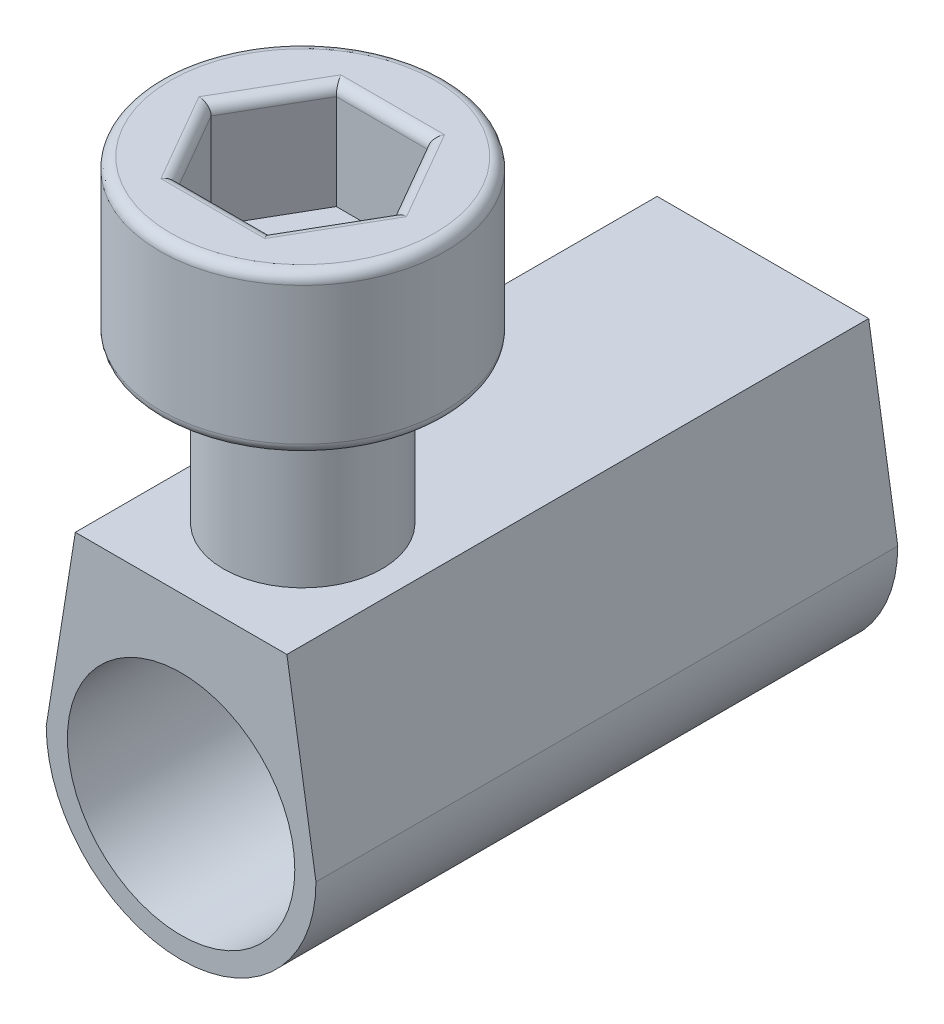
ISO-10303-21;
HEADER;
FILE_DESCRIPTION(('STEP AP214'),'2;1');
FILE_NAME('part.step','',(''),(''),'','','');
FILE_SCHEMA(('AUTOMOTIVE_DESIGN { 1 0 10303 214 1 1 1 1 }'));
ENDSEC;
DATA;
#1=APPLICATION_CONTEXT('core data for automotive mechanical design processes');
#2=APPLICATION_PROTOCOL_DEFINITION('international standard','automotive_design',2000,#1);
#3=PRODUCT_CONTEXT('',#1,'mechanical');
#4=PRODUCT('Part','Part','',(#3));
#5=PRODUCT_RELATED_PRODUCT_CATEGORY('part','',(#4));
#6=PRODUCT_DEFINITION_FORMATION('','',#4);
#7=PRODUCT_DEFINITION_CONTEXT('part definition',#1,'design');
#8=PRODUCT_DEFINITION('design','',#6,#7);
#9=PRODUCT_DEFINITION_SHAPE('','',#8);
#10=(LENGTH_UNIT() NAMED_UNIT(*) SI_UNIT(.MILLI.,.METRE.));
#11=(NAMED_UNIT(*) PLANE_ANGLE_UNIT() SI_UNIT($,.RADIAN.));
#12=(NAMED_UNIT(*) SI_UNIT($,.STERADIAN.) SOLID_ANGLE_UNIT());
#13=UNCERTAINTY_MEASURE_WITH_UNIT(LENGTH_MEASURE(1.E-05),#10,'distance_accuracy_value','');
#14=(GEOMETRIC_REPRESENTATION_CONTEXT(3) GLOBAL_UNCERTAINTY_ASSIGNED_CONTEXT((#13)) GLOBAL_UNIT_ASSIGNED_CONTEXT((#10,
#11,#12)) REPRESENTATION_CONTEXT('',''));
#15=CARTESIAN_POINT('',(0.,0.,0.));
#16=DIRECTION('',(0.,0.,1.));
#17=DIRECTION('',(1.,0.,0.));
#18=AXIS2_PLACEMENT_3D('',#15,#16,#17);
#19=CARTESIAN_POINT('',(0.,4.,-2.3));
#20=DIRECTION('',(0.,1.,0.));
#21=DIRECTION('',(0.,0.,1.));
#22=AXIS2_PLACEMENT_3D('',#19,#20,#21);
#23=CYLINDRICAL_SURFACE('',#22,1.5);
#24=CARTESIAN_POINT('',(0.,8.8,-2.3));
#25=DIRECTION('',(0.,1.,0.));
#26=DIRECTION('',(0.,0.,1.));
#27=AXIS2_PLACEMENT_3D('',#24,#25,#26);
#28=CIRCLE('',#27,1.5);
#29=CARTESIAN_POINT('',(0.,8.8,-0.8));
#30=VERTEX_POINT('',#29);
#31=EDGE_CURVE('E184',#30,#30,#28,.F.);
#32=ORIENTED_EDGE('',*,*,#31,.T.);
#33=EDGE_LOOP('',(#32));
#34=FACE_BOUND('',#33,.T.);
#35=CARTESIAN_POINT('',(0.,4.,-2.3));
#36=DIRECTION('',(0.,1.,0.));
#37=DIRECTION('',(0.,0.,1.));
#38=AXIS2_PLACEMENT_3D('',#35,#36,#37);
#39=CIRCLE('',#38,1.5);
#40=CARTESIAN_POINT('',(0.,4.,-0.8));
#41=VERTEX_POINT('',#40);
#42=EDGE_CURVE('E161',#41,#41,#39,.T.);
#43=ORIENTED_EDGE('',*,*,#42,.T.);
#44=EDGE_LOOP('',(#43));
#45=FACE_BOUND('',#44,.T.);
#46=ADVANCED_FACE('F51',(#34,#45),#23,.T.);
#47=CARTESIAN_POINT('',(0.,4.,-2.3));
#48=DIRECTION('',(0.,1.,0.));
#49=DIRECTION('',(0.,0.,1.));
#50=AXIS2_PLACEMENT_3D('',#47,#48,#49);
#51=PLANE('',#50);
#52=ORIENTED_EDGE('',*,*,#42,.F.);
#53=EDGE_LOOP('',(#52));
#54=FACE_BOUND('',#53,.T.);
#55=ADVANCED_FACE('F262',(#54),#51,.F.);
#56=CARTESIAN_POINT('',(0.,12.,-2.3));
#57=DIRECTION('',(0.,-1.,0.));
#58=DIRECTION('',(0.,0.,-1.));
#59=AXIS2_PLACEMENT_3D('',#56,#57,#58);
#60=CYLINDRICAL_SURFACE('',#59,2.7);
#61=CARTESIAN_POINT('',(0.,9.2,-2.3));
#62=DIRECTION('',(0.,1.,0.));
#63=DIRECTION('',(0.,0.,1.));
#64=AXIS2_PLACEMENT_3D('',#61,#62,#63);
#65=CIRCLE('',#64,2.7);
#66=CARTESIAN_POINT('',(0.,9.2,0.4));
#67=VERTEX_POINT('',#66);
#68=EDGE_CURVE('E175',#67,#67,#65,.T.);
#69=ORIENTED_EDGE('',*,*,#68,.T.);
#70=EDGE_LOOP('',(#69));
#71=FACE_BOUND('',#70,.T.);
#72=CARTESIAN_POINT('',(0.,11.8,-2.3));
#73=DIRECTION('',(0.,1.,0.));
#74=DIRECTION('',(0.,0.,1.));
#75=AXIS2_PLACEMENT_3D('',#72,#73,#74);
#76=CIRCLE('',#75,2.7);
#77=CARTESIAN_POINT('',(0.,11.8,0.4));
#78=VERTEX_POINT('',#77);
#79=EDGE_CURVE('E172',#78,#78,#76,.F.);
#80=ORIENTED_EDGE('',*,*,#79,.T.);
#81=EDGE_LOOP('',(#80));
#82=FACE_BOUND('',#81,.T.);
#83=ADVANCED_FACE('F268',(#71,#82),#60,.T.);
#84=CARTESIAN_POINT('',(0.,12.,-2.3));
#85=DIRECTION('',(0.,1.,0.));
#86=DIRECTION('',(0.,0.,1.));
#87=AXIS2_PLACEMENT_3D('',#84,#85,#86);
#88=PLANE('',#87);
#89=CARTESIAN_POINT('',(0.,12.,-2.3));
#90=DIRECTION('',(0.,1.,0.));
#91=DIRECTION('',(0.,0.,1.));
#92=AXIS2_PLACEMENT_3D('',#89,#90,#91);
#93=CIRCLE('',#92,2.5);
#94=CARTESIAN_POINT('',(0.,12.,0.2));
#95=VERTEX_POINT('',#94);
#96=EDGE_CURVE('E200',#95,#95,#93,.T.);
#97=ORIENTED_EDGE('',*,*,#96,.T.);
#98=EDGE_LOOP('',(#97));
#99=FACE_BOUND('',#98,.T.);
#100=DIRECTION('',(-1.,0.,0.));
#101=VECTOR('',#100,1.);
#102=CARTESIAN_POINT('',(0.866025403784439,12.,-4.));
#103=LINE('',#102,#101);
#104=CARTESIAN_POINT('',(-0.981495457622366,12.,-4.));
#105=VERTEX_POINT('',#104);
#106=CARTESIAN_POINT('',(0.981495457622364,12.,-4.));
#107=VERTEX_POINT('',#106);
#108=EDGE_CURVE('E195',#105,#107,#103,.F.);
#109=ORIENTED_EDGE('',*,*,#108,.T.);
#110=DIRECTION('',(-0.5,0.,-0.866025403784439));
#111=VECTOR('',#110,1.);
#112=CARTESIAN_POINT('',(1.90525588832577,12.,-2.4));
#113=LINE('',#112,#111);
#114=CARTESIAN_POINT('',(1.96299091524473,12.,-2.3));
#115=VERTEX_POINT('',#114);
#116=EDGE_CURVE('E197',#107,#115,#113,.F.);
#117=ORIENTED_EDGE('',*,*,#116,.T.);
#118=DIRECTION('',(0.5,0.,-0.866025403784439));
#119=VECTOR('',#118,1.);
#120=CARTESIAN_POINT('',(1.03923048454133,12.,-0.699999999999999));
#121=LINE('',#120,#119);
#122=CARTESIAN_POINT('',(0.981495457622364,12.,-0.599999999999999));
#123=VERTEX_POINT('',#122);
#124=EDGE_CURVE('E187',#115,#123,#121,.F.);
#125=ORIENTED_EDGE('',*,*,#124,.T.);
#126=DIRECTION('',(1.,0.,0.));
#127=VECTOR('',#126,1.);
#128=CARTESIAN_POINT('',(-0.866025403784439,12.,-0.599999999999998));
#129=LINE('',#128,#127);
#130=CARTESIAN_POINT('',(-0.981495457622364,12.,-0.599999999999998));
#131=VERTEX_POINT('',#130);
#132=EDGE_CURVE('E189',#123,#131,#129,.F.);
#133=ORIENTED_EDGE('',*,*,#132,.T.);
#134=DIRECTION('',(0.5,0.,0.866025403784439));
#135=VECTOR('',#134,1.);
#136=CARTESIAN_POINT('',(-1.90525588832577,12.,-2.2));
#137=LINE('',#136,#135);
#138=CARTESIAN_POINT('',(-1.96299091524473,12.,-2.3));
#139=VERTEX_POINT('',#138);
#140=EDGE_CURVE('E191',#131,#139,#137,.F.);
#141=ORIENTED_EDGE('',*,*,#140,.T.);
#142=DIRECTION('',(-0.5,0.,0.866025403784439));
#143=VECTOR('',#142,1.);
#144=CARTESIAN_POINT('',(-1.03923048454133,12.,-3.9));
#145=LINE('',#144,#143);
#146=EDGE_CURVE('E193',#139,#105,#145,.F.);
#147=ORIENTED_EDGE('',*,*,#146,.T.);
#148=EDGE_LOOP('',(#109,#117,#125,#133,#141,#147));
#149=FACE_BOUND('',#148,.T.);
#150=ADVANCED_FACE('F360',(#99,#149),#88,.T.);
#151=CARTESIAN_POINT('',(0.,9.,-2.3));
#152=DIRECTION('',(0.,1.,0.));
#153=DIRECTION('',(0.,0.,1.));
#154=AXIS2_PLACEMENT_3D('',#151,#152,#153);
#155=PLANE('',#154);
#156=CARTESIAN_POINT('',(0.,9.,-2.3));
#157=DIRECTION('',(0.,1.,0.));
#158=DIRECTION('',(0.,0.,1.));
#159=AXIS2_PLACEMENT_3D('',#156,#157,#158);
#160=CIRCLE('',#159,2.5);
#161=CARTESIAN_POINT('',(0.,9.,0.2));
#162=VERTEX_POINT('',#161);
#163=EDGE_CURVE('E181',#162,#162,#160,.F.);
#164=ORIENTED_EDGE('',*,*,#163,.T.);
#165=EDGE_LOOP('',(#164));
#166=FACE_BOUND('',#165,.T.);
#167=CARTESIAN_POINT('',(0.,9.,-2.3));
#168=DIRECTION('',(0.,1.,0.));
#169=DIRECTION('',(0.,0.,1.));
#170=AXIS2_PLACEMENT_3D('',#167,#168,#169);
#171=CIRCLE('',#170,1.7);
#172=CARTESIAN_POINT('',(0.,9.,-0.6));
#173=VERTEX_POINT('',#172);
#174=EDGE_CURVE('E178',#173,#173,#171,.T.);
#175=ORIENTED_EDGE('',*,*,#174,.T.);
#176=EDGE_LOOP('',(#175));
#177=FACE_BOUND('',#176,.T.);
#178=ADVANCED_FACE('F258',(#166,#177),#155,.F.);
#179=CARTESIAN_POINT('',(0.866025403784439,10.,-0.799999999999998));
#180=DIRECTION('',(0.866025403784439,0.,0.5));
#181=DIRECTION('',(0.5,0.,-0.866025403784439));
#182=AXIS2_PLACEMENT_3D('',#179,#180,#181);
#183=PLANE('',#182);
#184=DIRECTION('',(0.,1.,0.));
#185=VECTOR('',#184,1.);
#186=CARTESIAN_POINT('',(0.866025403784439,10.,-0.799999999999998));
#187=LINE('',#186,#185);
#188=CARTESIAN_POINT('',(0.866025403784439,10.,-0.799999999999998));
#189=VERTEX_POINT('',#188);
#190=CARTESIAN_POINT('',(0.866025403784439,11.8,-0.799999999999998));
#191=VERTEX_POINT('',#190);
#192=EDGE_CURVE('E159',#189,#191,#187,.T.);
#193=ORIENTED_EDGE('',*,*,#192,.T.);
#194=DIRECTION('',(0.5,0.,-0.866025403784439));
#195=VECTOR('',#194,1.);
#196=CARTESIAN_POINT('',(1.73205080756888,11.8,-2.3));
#197=LINE('',#196,#195);
#198=CARTESIAN_POINT('',(1.73205080756888,11.8,-2.3));
#199=VERTEX_POINT('',#198);
#200=EDGE_CURVE('E12',#191,#199,#197,.T.);
#201=ORIENTED_EDGE('',*,*,#200,.T.);
#202=DIRECTION('',(0.,1.,0.));
#203=VECTOR('',#202,1.);
#204=CARTESIAN_POINT('',(1.73205080756888,10.,-2.3));
#205=LINE('',#204,#203);
#206=CARTESIAN_POINT('',(1.73205080756888,10.,-2.3));
#207=VERTEX_POINT('',#206);
#208=EDGE_CURVE('E123',#207,#199,#205,.T.);
#209=ORIENTED_EDGE('',*,*,#208,.F.);
#210=DIRECTION('',(0.5,0.,-0.866025403784439));
#211=VECTOR('',#210,1.);
#212=CARTESIAN_POINT('',(0.866025403784439,10.,-0.799999999999998));
#213=LINE('',#212,#211);
#214=EDGE_CURVE('E127',#189,#207,#213,.T.);
#215=ORIENTED_EDGE('',*,*,#214,.F.);
#216=EDGE_LOOP('',(#193,#201,#209,#215));
#217=FACE_BOUND('',#216,.T.);
#218=ADVANCED_FACE('F125',(#217),#183,.F.);
#219=CARTESIAN_POINT('',(-0.866025403784439,10.,-0.799999999999998));
#220=DIRECTION('',(0.,0.,1.));
#221=DIRECTION('',(1.,0.,0.));
#222=AXIS2_PLACEMENT_3D('',#219,#220,#221);
#223=PLANE('',#222);
#224=DIRECTION('',(0.,1.,0.));
#225=VECTOR('',#224,1.);
#226=CARTESIAN_POINT('',(-0.866025403784439,10.,-0.799999999999998));
#227=LINE('',#226,#225);
#228=CARTESIAN_POINT('',(-0.866025403784439,10.,-0.799999999999998));
#229=VERTEX_POINT('',#228);
#230=CARTESIAN_POINT('',(-0.866025403784439,11.8,-0.799999999999998));
#231=VERTEX_POINT('',#230);
#232=EDGE_CURVE('E162',#229,#231,#227,.T.);
#233=ORIENTED_EDGE('',*,*,#232,.T.);
#234=DIRECTION('',(1.,0.,0.));
#235=VECTOR('',#234,1.);
#236=CARTESIAN_POINT('',(0.866025403784439,11.8,-0.799999999999998));
#237=LINE('',#236,#235);
#238=EDGE_CURVE('E60',#231,#191,#237,.T.);
#239=ORIENTED_EDGE('',*,*,#238,.T.);
#240=ORIENTED_EDGE('',*,*,#192,.F.);
#241=DIRECTION('',(1.,0.,0.));
#242=VECTOR('',#241,1.);
#243=CARTESIAN_POINT('',(-0.866025403784439,10.,-0.799999999999998));
#244=LINE('',#243,#242);
#245=EDGE_CURVE('E134',#229,#189,#244,.T.);
#246=ORIENTED_EDGE('',*,*,#245,.F.);
#247=EDGE_LOOP('',(#233,#239,#240,#246));
#248=FACE_BOUND('',#247,.T.);
#249=ADVANCED_FACE('F250',(#248),#223,.F.);
#250=CARTESIAN_POINT('',(-1.73205080756888,10.,-2.3));
#251=DIRECTION('',(-0.866025403784439,0.,0.5));
#252=DIRECTION('',(0.5,0.,0.866025403784439));
#253=AXIS2_PLACEMENT_3D('',#250,#251,#252);
#254=PLANE('',#253);
#255=DIRECTION('',(0.,1.,0.));
#256=VECTOR('',#255,1.);
#257=CARTESIAN_POINT('',(-1.73205080756888,10.,-2.3));
#258=LINE('',#257,#256);
#259=CARTESIAN_POINT('',(-1.73205080756888,10.,-2.3));
#260=VERTEX_POINT('',#259);
#261=CARTESIAN_POINT('',(-1.73205080756888,11.8,-2.3));
#262=VERTEX_POINT('',#261);
#263=EDGE_CURVE('E164',#260,#262,#258,.T.);
#264=ORIENTED_EDGE('',*,*,#263,.T.);
#265=DIRECTION('',(0.5,0.,0.866025403784439));
#266=VECTOR('',#265,1.);
#267=CARTESIAN_POINT('',(-0.866025403784439,11.8,-0.799999999999998));
#268=LINE('',#267,#266);
#269=EDGE_CURVE('E75',#262,#231,#268,.T.);
#270=ORIENTED_EDGE('',*,*,#269,.T.);
#271=ORIENTED_EDGE('',*,*,#232,.F.);
#272=DIRECTION('',(0.5,0.,0.866025403784438));
#273=VECTOR('',#272,1.);
#274=CARTESIAN_POINT('',(-1.73205080756888,10.,-2.3));
#275=LINE('',#274,#273);
#276=EDGE_CURVE('E156',#260,#229,#275,.T.);
#277=ORIENTED_EDGE('',*,*,#276,.F.);
#278=EDGE_LOOP('',(#264,#270,#271,#277));
#279=FACE_BOUND('',#278,.T.);
#280=ADVANCED_FACE('F249',(#279),#254,.F.);
#281=CARTESIAN_POINT('',(-0.86602540378444,10.,-3.8));
#282=DIRECTION('',(-0.866025403784439,0.,-0.5));
#283=DIRECTION('',(-0.5,0.,0.866025403784439));
#284=AXIS2_PLACEMENT_3D('',#281,#282,#283);
#285=PLANE('',#284);
#286=DIRECTION('',(0.,1.,0.));
#287=VECTOR('',#286,1.);
#288=CARTESIAN_POINT('',(-0.86602540378444,10.,-3.8));
#289=LINE('',#288,#287);
#290=CARTESIAN_POINT('',(-0.86602540378444,10.,-3.8));
#291=VERTEX_POINT('',#290);
#292=CARTESIAN_POINT('',(-0.86602540378444,11.8,-3.8));
#293=VERTEX_POINT('',#292);
#294=EDGE_CURVE('E166',#291,#293,#289,.T.);
#295=ORIENTED_EDGE('',*,*,#294,.T.);
#296=DIRECTION('',(-0.5,0.,0.866025403784439));
#297=VECTOR('',#296,1.);
#298=CARTESIAN_POINT('',(-1.73205080756888,11.8,-2.3));
#299=LINE('',#298,#297);
#300=EDGE_CURVE('E207',#293,#262,#299,.T.);
#301=ORIENTED_EDGE('',*,*,#300,.T.);
#302=ORIENTED_EDGE('',*,*,#263,.F.);
#303=DIRECTION('',(-0.5,0.,0.866025403784439));
#304=VECTOR('',#303,1.);
#305=CARTESIAN_POINT('',(-0.86602540378444,10.,-3.8));
#306=LINE('',#305,#304);
#307=EDGE_CURVE('E153',#291,#260,#306,.T.);
#308=ORIENTED_EDGE('',*,*,#307,.F.);
#309=EDGE_LOOP('',(#295,#301,#302,#308));
#310=FACE_BOUND('',#309,.T.);
#311=ADVANCED_FACE('F248',(#310),#285,.F.);
#312=CARTESIAN_POINT('',(0.866025403784439,10.,-3.8));
#313=DIRECTION('',(0.,0.,-1.));
#314=DIRECTION('',(-1.,0.,0.));
#315=AXIS2_PLACEMENT_3D('',#312,#313,#314);
#316=PLANE('',#315);
#317=DIRECTION('',(0.,1.,0.));
#318=VECTOR('',#317,1.);
#319=CARTESIAN_POINT('',(0.866025403784439,10.,-3.8));
#320=LINE('',#319,#318);
#321=CARTESIAN_POINT('',(0.866025403784439,10.,-3.8));
#322=VERTEX_POINT('',#321);
#323=CARTESIAN_POINT('',(0.866025403784439,11.8,-3.8));
#324=VERTEX_POINT('',#323);
#325=EDGE_CURVE('E133',#322,#324,#320,.T.);
#326=ORIENTED_EDGE('',*,*,#325,.T.);
#327=DIRECTION('',(-1.,0.,0.));
#328=VECTOR('',#327,1.);
#329=CARTESIAN_POINT('',(-0.86602540378444,11.8,-3.8));
#330=LINE('',#329,#328);
#331=EDGE_CURVE('E205',#324,#293,#330,.T.);
#332=ORIENTED_EDGE('',*,*,#331,.T.);
#333=ORIENTED_EDGE('',*,*,#294,.F.);
#334=DIRECTION('',(-1.,0.,0.));
#335=VECTOR('',#334,1.);
#336=CARTESIAN_POINT('',(0.866025403784439,10.,-3.8));
#337=LINE('',#336,#335);
#338=EDGE_CURVE('E143',#322,#291,#337,.T.);
#339=ORIENTED_EDGE('',*,*,#338,.F.);
#340=EDGE_LOOP('',(#326,#332,#333,#339));
#341=FACE_BOUND('',#340,.T.);
#342=ADVANCED_FACE('F244',(#341),#316,.F.);
#343=CARTESIAN_POINT('',(1.73205080756888,10.,-2.3));
#344=DIRECTION('',(0.866025403784439,0.,-0.5));
#345=DIRECTION('',(-0.5,0.,-0.866025403784439));
#346=AXIS2_PLACEMENT_3D('',#343,#344,#345);
#347=PLANE('',#346);
#348=ORIENTED_EDGE('',*,*,#208,.T.);
#349=DIRECTION('',(-0.5,0.,-0.866025403784439));
#350=VECTOR('',#349,1.);
#351=CARTESIAN_POINT('',(0.866025403784439,11.8,-3.8));
#352=LINE('',#351,#350);
#353=EDGE_CURVE('E203',#199,#324,#352,.T.);
#354=ORIENTED_EDGE('',*,*,#353,.T.);
#355=ORIENTED_EDGE('',*,*,#325,.F.);
#356=DIRECTION('',(-0.5,0.,-0.866025403784439));
#357=VECTOR('',#356,1.);
#358=CARTESIAN_POINT('',(1.73205080756888,10.,-2.3));
#359=LINE('',#358,#357);
#360=EDGE_CURVE('E137',#207,#322,#359,.T.);
#361=ORIENTED_EDGE('',*,*,#360,.F.);
#362=EDGE_LOOP('',(#348,#354,#355,#361));
#363=FACE_BOUND('',#362,.T.);
#364=ADVANCED_FACE('F138',(#363),#347,.F.);
#365=CARTESIAN_POINT('',(0.,10.,0.));
#366=DIRECTION('',(0.,1.,0.));
#367=DIRECTION('',(0.,0.,1.));
#368=AXIS2_PLACEMENT_3D('',#365,#366,#367);
#369=PLANE('',#368);
#370=ORIENTED_EDGE('',*,*,#214,.T.);
#371=ORIENTED_EDGE('',*,*,#360,.T.);
#372=ORIENTED_EDGE('',*,*,#338,.T.);
#373=ORIENTED_EDGE('',*,*,#307,.T.);
#374=ORIENTED_EDGE('',*,*,#276,.T.);
#375=ORIENTED_EDGE('',*,*,#245,.T.);
#376=EDGE_LOOP('',(#370,#371,#372,#373,#374,#375));
#377=FACE_BOUND('',#376,.T.);
#378=ADVANCED_FACE('F145',(#377),#369,.T.);
#379=CARTESIAN_POINT('',(0.,9.2,-2.3));
#380=DIRECTION('',(0.,1.,0.));
#381=DIRECTION('',(0.,0.,1.));
#382=AXIS2_PLACEMENT_3D('',#379,#380,#381);
#383=TOROIDAL_SURFACE('',#382,2.5,0.2);
#384=ORIENTED_EDGE('',*,*,#163,.F.);
#385=EDGE_LOOP('',(#384));
#386=FACE_BOUND('',#385,.T.);
#387=ORIENTED_EDGE('',*,*,#68,.F.);
#388=EDGE_LOOP('',(#387));
#389=FACE_BOUND('',#388,.T.);
#390=ADVANCED_FACE('F274',(#386,#389),#383,.T.);
#391=CARTESIAN_POINT('',(0.,8.8,-2.3));
#392=DIRECTION('',(0.,1.,0.));
#393=DIRECTION('',(0.,0.,1.));
#394=AXIS2_PLACEMENT_3D('',#391,#392,#393);
#395=TOROIDAL_SURFACE('',#394,1.7,0.2);
#396=ORIENTED_EDGE('',*,*,#31,.F.);
#397=EDGE_LOOP('',(#396));
#398=FACE_BOUND('',#397,.T.);
#399=ORIENTED_EDGE('',*,*,#174,.F.);
#400=EDGE_LOOP('',(#399));
#401=FACE_BOUND('',#400,.T.);
#402=ADVANCED_FACE('F277',(#398,#401),#395,.F.);
#403=CARTESIAN_POINT('',(0.,11.8,-2.3));
#404=DIRECTION('',(0.,1.,0.));
#405=DIRECTION('',(0.,0.,1.));
#406=AXIS2_PLACEMENT_3D('',#403,#404,#405);
#407=TOROIDAL_SURFACE('',#406,2.5,0.2);
#408=ORIENTED_EDGE('',*,*,#79,.F.);
#409=EDGE_LOOP('',(#408));
#410=FACE_BOUND('',#409,.T.);
#411=ORIENTED_EDGE('',*,*,#96,.F.);
#412=EDGE_LOOP('',(#411));
#413=FACE_BOUND('',#412,.T.);
#414=ADVANCED_FACE('F281',(#410,#413),#407,.T.);
#415=CARTESIAN_POINT('',(-1.90525588832577,11.8,-2.2));
#416=DIRECTION('',(-0.5,0.,-0.866025403784439));
#417=DIRECTION('',(-0.866025403784439,0.,0.5));
#418=AXIS2_PLACEMENT_3D('',#415,#416,#417);
#419=CYLINDRICAL_SURFACE('',#418,0.2);
#420=CARTESIAN_POINT('',(-1.96299091524473,11.8,-2.3));
#421=DIRECTION('',(0.,0.,-1.));
#422=DIRECTION('',(1.,0.,0.));
#423=AXIS2_PLACEMENT_3D('',#420,#421,#422);
#424=ELLIPSE('',#423,0.23094010767585,0.2);
#425=EDGE_CURVE('E150',#139,#262,#424,.T.);
#426=ORIENTED_EDGE('',*,*,#425,.F.);
#427=ORIENTED_EDGE('',*,*,#140,.F.);
#428=CARTESIAN_POINT('',(-0.981495457622365,11.8,-0.599999999999999));
#429=DIRECTION('',(-0.866025403784439,0.,-0.5));
#430=DIRECTION('',(0.5,0.,-0.866025403784439));
#431=AXIS2_PLACEMENT_3D('',#428,#429,#430);
#432=ELLIPSE('',#431,0.23094010767585,0.2);
#433=EDGE_CURVE('E55',#231,#131,#432,.F.);
#434=ORIENTED_EDGE('',*,*,#433,.F.);
#435=ORIENTED_EDGE('',*,*,#269,.F.);
#436=EDGE_LOOP('',(#426,#427,#434,#435));
#437=FACE_BOUND('',#436,.T.);
#438=ADVANCED_FACE('F53',(#437),#419,.T.);
#439=CARTESIAN_POINT('',(-0.866025403784439,11.8,-0.599999999999998));
#440=DIRECTION('',(-1.,0.,0.));
#441=DIRECTION('',(0.,0.,1.));
#442=AXIS2_PLACEMENT_3D('',#439,#440,#441);
#443=CYLINDRICAL_SURFACE('',#442,0.2);
#444=ORIENTED_EDGE('',*,*,#433,.T.);
#445=ORIENTED_EDGE('',*,*,#132,.F.);
#446=CARTESIAN_POINT('',(0.981495457622365,11.8,-0.599999999999999));
#447=DIRECTION('',(-0.866025403784439,0.,0.5));
#448=DIRECTION('',(-0.5,0.,-0.866025403784439));
#449=AXIS2_PLACEMENT_3D('',#446,#447,#448);
#450=ELLIPSE('',#449,0.23094010767585,0.2);
#451=EDGE_CURVE('E218',#191,#123,#450,.F.);
#452=ORIENTED_EDGE('',*,*,#451,.F.);
#453=ORIENTED_EDGE('',*,*,#238,.F.);
#454=EDGE_LOOP('',(#444,#445,#452,#453));
#455=FACE_BOUND('',#454,.T.);
#456=ADVANCED_FACE('F233',(#455),#443,.T.);
#457=CARTESIAN_POINT('',(-1.03923048454133,11.8,-3.9));
#458=DIRECTION('',(0.5,0.,-0.866025403784439));
#459=DIRECTION('',(-0.866025403784439,0.,-0.5));
#460=AXIS2_PLACEMENT_3D('',#457,#458,#459);
#461=CYLINDRICAL_SURFACE('',#460,0.2);
#462=ORIENTED_EDGE('',*,*,#425,.T.);
#463=ORIENTED_EDGE('',*,*,#300,.F.);
#464=CARTESIAN_POINT('',(-0.981495457622365,11.8,-4.));
#465=DIRECTION('',(0.866025403784438,0.,-0.5));
#466=DIRECTION('',(0.5,0.,0.866025403784438));
#467=AXIS2_PLACEMENT_3D('',#464,#465,#466);
#468=ELLIPSE('',#467,0.23094010767585,0.2);
#469=EDGE_CURVE('E215',#105,#293,#468,.T.);
#470=ORIENTED_EDGE('',*,*,#469,.F.);
#471=ORIENTED_EDGE('',*,*,#146,.F.);
#472=EDGE_LOOP('',(#462,#463,#470,#471));
#473=FACE_BOUND('',#472,.T.);
#474=ADVANCED_FACE('F225',(#473),#461,.T.);
#475=CARTESIAN_POINT('',(1.03923048454133,11.8,-0.699999999999999));
#476=DIRECTION('',(-0.5,0.,0.866025403784439));
#477=DIRECTION('',(0.866025403784439,0.,0.5));
#478=AXIS2_PLACEMENT_3D('',#475,#476,#477);
#479=CYLINDRICAL_SURFACE('',#478,0.2);
#480=ORIENTED_EDGE('',*,*,#451,.T.);
#481=ORIENTED_EDGE('',*,*,#124,.F.);
#482=CARTESIAN_POINT('',(1.96299091524473,11.8,-2.3));
#483=DIRECTION('',(0.,0.,1.));
#484=DIRECTION('',(1.,0.,0.));
#485=AXIS2_PLACEMENT_3D('',#482,#483,#484);
#486=ELLIPSE('',#485,0.23094010767585,0.2);
#487=EDGE_CURVE('E213',#199,#115,#486,.F.);
#488=ORIENTED_EDGE('',*,*,#487,.F.);
#489=ORIENTED_EDGE('',*,*,#200,.F.);
#490=EDGE_LOOP('',(#480,#481,#488,#489));
#491=FACE_BOUND('',#490,.T.);
#492=ADVANCED_FACE('F236',(#491),#479,.T.);
#493=CARTESIAN_POINT('',(0.866025403784439,11.8,-4.));
#494=DIRECTION('',(1.,0.,0.));
#495=DIRECTION('',(0.,0.,-1.));
#496=AXIS2_PLACEMENT_3D('',#493,#494,#495);
#497=CYLINDRICAL_SURFACE('',#496,0.2);
#498=ORIENTED_EDGE('',*,*,#469,.T.);
#499=ORIENTED_EDGE('',*,*,#331,.F.);
#500=CARTESIAN_POINT('',(0.981495457622364,11.8,-4.));
#501=DIRECTION('',(0.866025403784439,0.,0.5));
#502=DIRECTION('',(-0.5,0.,0.866025403784439));
#503=AXIS2_PLACEMENT_3D('',#500,#501,#502);
#504=ELLIPSE('',#503,0.23094010767585,0.2);
#505=EDGE_CURVE('E211',#107,#324,#504,.T.);
#506=ORIENTED_EDGE('',*,*,#505,.F.);
#507=ORIENTED_EDGE('',*,*,#108,.F.);
#508=EDGE_LOOP('',(#498,#499,#506,#507));
#509=FACE_BOUND('',#508,.T.);
#510=ADVANCED_FACE('F288',(#509),#497,.T.);
#511=CARTESIAN_POINT('',(1.90525588832577,11.8,-2.4));
#512=DIRECTION('',(0.5,0.,0.866025403784439));
#513=DIRECTION('',(0.866025403784439,0.,-0.5));
#514=AXIS2_PLACEMENT_3D('',#511,#512,#513);
#515=CYLINDRICAL_SURFACE('',#514,0.2);
#516=ORIENTED_EDGE('',*,*,#487,.T.);
#517=ORIENTED_EDGE('',*,*,#116,.F.);
#518=ORIENTED_EDGE('',*,*,#505,.T.);
#519=ORIENTED_EDGE('',*,*,#353,.F.);
#520=EDGE_LOOP('',(#516,#517,#518,#519));
#521=FACE_BOUND('',#520,.T.);
#522=ADVANCED_FACE('F240',(#521),#515,.T.);
#523=CLOSED_SHELL('',(#46,#55,#83,#150,#178,#218,#249,#280,#311,#342,#364,#378,#390,#402,#414,
#438,#456,#474,#492,#510,#522));
#524=MANIFOLD_SOLID_BREP('B2',#523);
#525=CARTESIAN_POINT('',(-2.55,2.55,-11.));
#526=DIRECTION('',(-0.987529784760243,0.157432284526995,0.));
#527=DIRECTION('',(-0.157432284526995,-0.987529784760243,0.));
#528=AXIS2_PLACEMENT_3D('',#525,#526,#527);
#529=PLANE('',#528);
#530=DIRECTION('',(-0.157432284526995,-0.987529784760243,0.));
#531=VECTOR('',#530,1.);
#532=CARTESIAN_POINT('',(-2.55,2.55,0.));
#533=LINE('',#532,#531);
#534=CARTESIAN_POINT('',(-2.,6.,0.));
#535=VERTEX_POINT('',#534);
#536=CARTESIAN_POINT('',(-2.55,2.55,0.));
#537=VERTEX_POINT('',#536);
#538=EDGE_CURVE('E523',#535,#537,#533,.T.);
#539=ORIENTED_EDGE('',*,*,#538,.F.);
#540=DIRECTION('',(0.,0.,1.));
#541=VECTOR('',#540,1.);
#542=CARTESIAN_POINT('',(-2.,6.,-11.));
#543=LINE('',#542,#541);
#544=CARTESIAN_POINT('',(-2.,6.,-11.));
#545=VERTEX_POINT('',#544);
#546=EDGE_CURVE('E49',#545,#535,#543,.T.);
#547=ORIENTED_EDGE('',*,*,#546,.F.);
#548=DIRECTION('',(-0.157432284526995,-0.987529784760243,0.));
#549=VECTOR('',#548,1.);
#550=CARTESIAN_POINT('',(-2.55,2.55,-11.));
#551=LINE('',#550,#549);
#552=CARTESIAN_POINT('',(-2.55,2.55,-11.));
#553=VERTEX_POINT('',#552);
#554=EDGE_CURVE('E514',#545,#553,#551,.T.);
#555=ORIENTED_EDGE('',*,*,#554,.T.);
#556=DIRECTION('',(0.,0.,1.));
#557=VECTOR('',#556,1.);
#558=CARTESIAN_POINT('',(-2.55,2.55,-11.));
#559=LINE('',#558,#557);
#560=EDGE_CURVE('E455',#553,#537,#559,.T.);
#561=ORIENTED_EDGE('',*,*,#560,.T.);
#562=EDGE_LOOP('',(#539,#547,#555,#561));
#563=FACE_BOUND('',#562,.T.);
#564=ADVANCED_FACE('F452',(#563),#529,.T.);
#565=CARTESIAN_POINT('',(-2.,6.,-11.));
#566=DIRECTION('',(0.,1.,0.));
#567=DIRECTION('',(0.,0.,1.));
#568=AXIS2_PLACEMENT_3D('',#565,#566,#567);
#569=PLANE('',#568);
#570=CARTESIAN_POINT('',(0.,6.,-2.3));
#571=DIRECTION('',(0.,1.,0.));
#572=DIRECTION('',(0.,0.,1.));
#573=AXIS2_PLACEMENT_3D('',#570,#571,#572);
#574=CIRCLE('',#573,1.5);
#575=CARTESIAN_POINT('',(0.,6.,-0.8));
#576=VERTEX_POINT('',#575);
#577=EDGE_CURVE('E581',#576,#576,#574,.T.);
#578=ORIENTED_EDGE('',*,*,#577,.F.);
#579=EDGE_LOOP('',(#578));
#580=FACE_BOUND('',#579,.T.);
#581=DIRECTION('',(-1.,0.,0.));
#582=VECTOR('',#581,1.);
#583=CARTESIAN_POINT('',(-2.,6.,0.));
#584=LINE('',#583,#582);
#585=CARTESIAN_POINT('',(2.,6.,0.));
#586=VERTEX_POINT('',#585);
#587=EDGE_CURVE('E517',#586,#535,#584,.T.);
#588=ORIENTED_EDGE('',*,*,#587,.F.);
#589=DIRECTION('',(0.,0.,1.));
#590=VECTOR('',#589,1.);
#591=CARTESIAN_POINT('',(2.,6.,-11.));
#592=LINE('',#591,#590);
#593=CARTESIAN_POINT('',(2.,6.,-11.));
#594=VERTEX_POINT('',#593);
#595=EDGE_CURVE('E462',#594,#586,#592,.T.);
#596=ORIENTED_EDGE('',*,*,#595,.F.);
#597=DIRECTION('',(-1.,0.,0.));
#598=VECTOR('',#597,1.);
#599=CARTESIAN_POINT('',(-2.,6.,-11.));
#600=LINE('',#599,#598);
#601=EDGE_CURVE('E509',#594,#545,#600,.T.);
#602=ORIENTED_EDGE('',*,*,#601,.T.);
#603=ORIENTED_EDGE('',*,*,#546,.T.);
#604=EDGE_LOOP('',(#588,#596,#602,#603));
#605=FACE_BOUND('',#604,.T.);
#606=ADVANCED_FACE('F540',(#580,#605),#569,.T.);
#607=CARTESIAN_POINT('',(2.,6.,-11.));
#608=DIRECTION('',(0.987529784760243,0.157432284526995,0.));
#609=DIRECTION('',(-0.157432284526995,0.987529784760243,0.));
#610=AXIS2_PLACEMENT_3D('',#607,#608,#609);
#611=PLANE('',#610);
#612=DIRECTION('',(-0.157432284526995,0.987529784760243,0.));
#613=VECTOR('',#612,1.);
#614=CARTESIAN_POINT('',(2.,6.,0.));
#615=LINE('',#614,#613);
#616=CARTESIAN_POINT('',(2.55,2.55,0.));
#617=VERTEX_POINT('',#616);
#618=EDGE_CURVE('E503',#617,#586,#615,.T.);
#619=ORIENTED_EDGE('',*,*,#618,.F.);
#620=DIRECTION('',(0.,0.,1.));
#621=VECTOR('',#620,1.);
#622=CARTESIAN_POINT('',(2.55,2.55,-11.));
#623=LINE('',#622,#621);
#624=CARTESIAN_POINT('',(2.55,2.55,-11.));
#625=VERTEX_POINT('',#624);
#626=EDGE_CURVE('E498',#625,#617,#623,.T.);
#627=ORIENTED_EDGE('',*,*,#626,.F.);
#628=DIRECTION('',(-0.157432284526995,0.987529784760243,0.));
#629=VECTOR('',#628,1.);
#630=CARTESIAN_POINT('',(2.,6.,-11.));
#631=LINE('',#630,#629);
#632=EDGE_CURVE('E501',#625,#594,#631,.T.);
#633=ORIENTED_EDGE('',*,*,#632,.T.);
#634=ORIENTED_EDGE('',*,*,#595,.T.);
#635=EDGE_LOOP('',(#619,#627,#633,#634));
#636=FACE_BOUND('',#635,.T.);
#637=ADVANCED_FACE('F500',(#636),#611,.T.);
#638=CARTESIAN_POINT('',(0.,2.55,-11.));
#639=DIRECTION('',(0.,0.,1.));
#640=DIRECTION('',(1.,0.,0.));
#641=AXIS2_PLACEMENT_3D('',#638,#639,#640);
#642=CYLINDRICAL_SURFACE('',#641,2.55);
#643=CARTESIAN_POINT('',(0.,2.55,0.));
#644=DIRECTION('',(0.,0.,1.));
#645=DIRECTION('',(-1.,0.,0.));
#646=AXIS2_PLACEMENT_3D('',#643,#644,#645);
#647=CIRCLE('',#646,2.55);
#648=EDGE_CURVE('E527',#537,#617,#647,.T.);
#649=ORIENTED_EDGE('',*,*,#648,.F.);
#650=ORIENTED_EDGE('',*,*,#560,.F.);
#651=CARTESIAN_POINT('',(0.,2.55,-11.));
#652=DIRECTION('',(0.,0.,1.));
#653=DIRECTION('',(-1.,0.,0.));
#654=AXIS2_PLACEMENT_3D('',#651,#652,#653);
#655=CIRCLE('',#654,2.55);
#656=EDGE_CURVE('E508',#553,#625,#655,.T.);
#657=ORIENTED_EDGE('',*,*,#656,.T.);
#658=ORIENTED_EDGE('',*,*,#626,.T.);
#659=EDGE_LOOP('',(#649,#650,#657,#658));
#660=FACE_BOUND('',#659,.T.);
#661=ADVANCED_FACE('F512',(#660),#642,.T.);
#662=CARTESIAN_POINT('',(0.,2.55,-11.));
#663=DIRECTION('',(0.,0.,-1.));
#664=DIRECTION('',(-1.,0.,0.));
#665=AXIS2_PLACEMENT_3D('',#662,#663,#664);
#666=PLANE('',#665);
#667=CARTESIAN_POINT('',(0.,2.55,-11.));
#668=DIRECTION('',(0.,0.,1.));
#669=DIRECTION('',(1.,0.,0.));
#670=AXIS2_PLACEMENT_3D('',#667,#668,#669);
#671=CIRCLE('',#670,2.15);
#672=CARTESIAN_POINT('',(2.15,2.55,-11.));
#673=VERTEX_POINT('',#672);
#674=EDGE_CURVE('E528',#673,#673,#671,.T.);
#675=ORIENTED_EDGE('',*,*,#674,.T.);
#676=EDGE_LOOP('',(#675));
#677=FACE_BOUND('',#676,.T.);
#678=ORIENTED_EDGE('',*,*,#554,.F.);
#679=ORIENTED_EDGE('',*,*,#601,.F.);
#680=ORIENTED_EDGE('',*,*,#632,.F.);
#681=ORIENTED_EDGE('',*,*,#656,.F.);
#682=EDGE_LOOP('',(#678,#679,#680,#681));
#683=FACE_BOUND('',#682,.T.);
#684=ADVANCED_FACE('F507',(#677,#683),#666,.T.);
#685=CARTESIAN_POINT('',(0.,2.55,0.));
#686=DIRECTION('',(0.,0.,-1.));
#687=DIRECTION('',(-1.,0.,0.));
#688=AXIS2_PLACEMENT_3D('',#685,#686,#687);
#689=PLANE('',#688);
#690=CARTESIAN_POINT('',(0.,2.55,0.));
#691=DIRECTION('',(0.,0.,1.));
#692=DIRECTION('',(1.,0.,0.));
#693=AXIS2_PLACEMENT_3D('',#690,#691,#692);
#694=CIRCLE('',#693,2.15);
#695=CARTESIAN_POINT('',(2.15,2.55,0.));
#696=VERTEX_POINT('',#695);
#697=EDGE_CURVE('E585',#696,#696,#694,.T.);
#698=ORIENTED_EDGE('',*,*,#697,.F.);
#699=EDGE_LOOP('',(#698));
#700=FACE_BOUND('',#699,.T.);
#701=ORIENTED_EDGE('',*,*,#538,.T.);
#702=ORIENTED_EDGE('',*,*,#648,.T.);
#703=ORIENTED_EDGE('',*,*,#618,.T.);
#704=ORIENTED_EDGE('',*,*,#587,.T.);
#705=EDGE_LOOP('',(#701,#702,#703,#704));
#706=FACE_BOUND('',#705,.T.);
#707=ADVANCED_FACE('F539',(#700,#706),#689,.F.);
#708=CARTESIAN_POINT('',(0.,2.55,-11.));
#709=DIRECTION('',(0.,0.,1.));
#710=DIRECTION('',(1.,0.,0.));
#711=AXIS2_PLACEMENT_3D('',#708,#709,#710);
#712=CYLINDRICAL_SURFACE('',#711,2.15);
#713=CARTESIAN_POINT('',(0.,4.7,-0.8));
#714=CARTESIAN_POINT('',(-0.0746464812663337,4.70000282641263,-0.799996929496405));
#715=CARTESIAN_POINT('',(-0.149277180476069,4.6960809829614,-0.80560151303327));
#716=CARTESIAN_POINT('',(-0.29613428994231,4.68078803821147,-0.827647971052697));
#717=CARTESIAN_POINT('',(-0.368359889040576,4.66941444990432,-0.844093463683328));
#718=CARTESIAN_POINT('',(-0.508056243300109,4.64032364191206,-0.88677865173462));
#719=CARTESIAN_POINT('',(-0.575548163520699,4.62263714305727,-0.912970941653959));
#720=CARTESIAN_POINT('',(-0.704857005323505,4.58230653566732,-0.973993377528605));
#721=CARTESIAN_POINT('',(-0.766673103764453,4.55966170965299,-1.00882477367562));
#722=CARTESIAN_POINT('',(-0.889035217129865,4.50879657072506,-1.08944207193295));
#723=CARTESIAN_POINT('',(-0.948989528092066,4.48026081548717,-1.13592272510136));
#724=CARTESIAN_POINT('',(-1.06079257205669,4.42115680639133,-1.23679733449923));
#725=CARTESIAN_POINT('',(-1.1126289613356,4.39058555613566,-1.29120310344179));
#726=CARTESIAN_POINT('',(-1.21601711406621,4.32431436419345,-1.41734698746795));
#727=CARTESIAN_POINT('',(-1.26593565795947,4.28865191343429,-1.49045246249999));
#728=CARTESIAN_POINT('',(-1.35280066322279,4.22195215158785,-1.64591501365008));
#729=CARTESIAN_POINT('',(-1.38976891344895,4.19090712284115,-1.72825623937877));
#730=CARTESIAN_POINT('',(-1.43970529082291,4.14702679941268,-1.87430618829028));
#731=CARTESIAN_POINT('',(-1.45656086118332,4.13152996642698,-1.93587637409803));
#732=CARTESIAN_POINT('',(-1.48237290477855,4.10736606480379,-2.06190408565345));
#733=CARTESIAN_POINT('',(-1.49134470044406,4.09868575149741,-2.12635575364091));
#734=CARTESIAN_POINT('',(-1.50081204155495,4.08951730308727,-2.25685378311678));
#735=CARTESIAN_POINT('',(-1.50126005231938,4.08907510987882,-2.32290703189861));
#736=CARTESIAN_POINT('',(-1.49351718879468,4.09658677525499,-2.45403726485773));
#737=CARTESIAN_POINT('',(-1.48532031903166,4.10454646078802,-2.51911353970959));
#738=CARTESIAN_POINT('',(-1.46168867886267,4.12676962885257,-2.64227227686338));
#739=CARTESIAN_POINT('',(-1.44675368180077,4.14059443812693,-2.70053530322033));
#740=CARTESIAN_POINT('',(-1.41054043997062,4.17279478750898,-2.81372412931401));
#741=CARTESIAN_POINT('',(-1.38925713374324,4.19117395678748,-2.86864722392484));
#742=CARTESIAN_POINT('',(-1.32823315567278,4.24131864059894,-3.00264716854597));
#743=CARTESIAN_POINT('',(-1.28466954111212,4.27504476531662,-3.0792582736566));
#744=CARTESIAN_POINT('',(-1.18546836369209,4.34467380086257,-3.2232160399966));
#745=CARTESIAN_POINT('',(-1.12980649044838,4.38058098811951,-3.2905435949636));
#746=CARTESIAN_POINT('',(-1.0064626047643,4.45122220916834,-3.41572210835592));
#747=CARTESIAN_POINT('',(-0.938649996983777,4.48593805412114,-3.47345546405061));
#748=CARTESIAN_POINT('',(-0.792310843467449,4.55027518614157,-3.57680466326641));
#749=CARTESIAN_POINT('',(-0.713807038517071,4.57990699279365,-3.62244563683341));
#750=CARTESIAN_POINT('',(-0.566029474817526,4.62525853958029,-3.69093383571441));
#751=CARTESIAN_POINT('',(-0.498556860077705,4.64260581397851,-3.71659002237591));
#752=CARTESIAN_POINT('',(-0.359381656305813,4.67093681911277,-3.75811718310157));
#753=CARTESIAN_POINT('',(-0.287681984016925,4.68192488247621,-3.77399481991505));
#754=CARTESIAN_POINT('',(-0.14168341979521,4.69658483567967,-3.79512043785617));
#755=CARTESIAN_POINT('',(-0.0673753793422577,4.70022765411263,-3.80032618254339));
#756=CARTESIAN_POINT('',(0.0811660448609202,4.69975023160795,-3.79964212023257));
#757=CARTESIAN_POINT('',(0.155399430983886,4.6956302457335,-3.79375267779012));
#758=CARTESIAN_POINT('',(0.296722918007628,4.68053696500188,-3.77198611286174));
#759=CARTESIAN_POINT('',(0.36396661685682,4.67001762152833,-3.75677008983042));
#760=CARTESIAN_POINT('',(0.494710015315331,4.64337465109581,-3.71771672398735));
#761=CARTESIAN_POINT('',(0.55820901507765,4.62724998041492,-3.69387777553797));
#762=CARTESIAN_POINT('',(0.684738185868132,4.58919309262423,-3.63652621342598));
#763=CARTESIAN_POINT('',(0.747405803084287,4.56692646055869,-3.60244092422282));
#764=CARTESIAN_POINT('',(0.866343360429129,4.51877468811147,-3.52655366773064));
#765=CARTESIAN_POINT('',(0.922609140606217,4.49288721896698,-3.48474672862605));
#766=CARTESIAN_POINT('',(1.03728592845545,4.43450253892368,-3.38658622678746));
#767=CARTESIAN_POINT('',(1.09442389764902,4.40163133147718,-3.32896775083602));
#768=CARTESIAN_POINT('',(1.19876147058957,4.33585418275358,-3.20527651384577));
#769=CARTESIAN_POINT('',(1.24595359651053,4.30294823390442,-3.13919745125541));
#770=CARTESIAN_POINT('',(1.32535814778501,4.24355491956841,-3.00625537522231));
#771=CARTESIAN_POINT('',(1.35860492519762,4.21675507791341,-2.9401529523237));
#772=CARTESIAN_POINT('',(1.41545082166218,4.16876081652021,-2.8020444024483));
#773=CARTESIAN_POINT('',(1.43906883292168,4.14755544923852,-2.7300501722469));
#774=CARTESIAN_POINT('',(1.47178034958967,4.11740555899251,-2.59602644089222));
#775=CARTESIAN_POINT('',(1.48282219274469,4.10686591511475,-2.53484068461457));
#776=CARTESIAN_POINT('',(1.49720129083688,4.09304699033984,-2.41078926709203));
#777=CARTESIAN_POINT('',(1.50054815900982,4.08975865068954,-2.34792580127221));
#778=CARTESIAN_POINT('',(1.49930404329214,4.09096963381113,-2.22229552662592));
#779=CARTESIAN_POINT('',(1.49470529140864,4.0954765776047,-2.15952887250138));
#780=CARTESIAN_POINT('',(1.47789289288235,4.1115573803125,-2.03592191150096));
#781=CARTESIAN_POINT('',(1.46566814783305,4.12314153846585,-1.97508454823875));
#782=CARTESIAN_POINT('',(1.42976886878213,4.15592727786241,-1.83957717531151));
#783=CARTESIAN_POINT('',(1.40381298180728,4.17893635863889,-1.76595882138343));
#784=CARTESIAN_POINT('',(1.34183495117882,4.23035622651294,-1.62515015982762));
#785=CARTESIAN_POINT('',(1.3057972259921,4.25877535296519,-1.55797002000032));
#786=CARTESIAN_POINT('',(1.22365626100859,4.31856076883727,-1.42899929538261));
#787=CARTESIAN_POINT('',(1.17733703186771,4.34998049718293,-1.36737180399964));
#788=CARTESIAN_POINT('',(1.07573099461556,4.4124892257367,-1.25179895829058));
#789=CARTESIAN_POINT('',(1.02044121338121,4.44357811264082,-1.1978561620844));
#790=CARTESIAN_POINT('',(0.890761949805932,4.50836163247384,-1.08967986289466));
#791=CARTESIAN_POINT('',(0.814723976716726,4.54154380565723,-1.03708419147152));
#792=CARTESIAN_POINT('',(0.652060884423269,4.60055246423997,-0.945943843982087));
#793=CARTESIAN_POINT('',(0.5654496689953,4.62638846403191,-0.907380975049709));
#794=CARTESIAN_POINT('',(0.399525837190707,4.66396536911125,-0.852006219704818));
#795=CARTESIAN_POINT('',(0.321448960720691,4.6773493433829,-0.832621599235794));
#796=CARTESIAN_POINT('',(0.162239413301276,4.69536005616428,-0.806627549610201));
#797=CARTESIAN_POINT('',(0.0811103898265152,4.69999692883809,-0.800003336389596));
#798=CARTESIAN_POINT('',(0.,4.7,-0.8));
#799=B_SPLINE_CURVE_WITH_KNOTS('',3,(#713,#714,#715,#716,#717,#718,#719,#720,#721,#722,#723,
#724,#725,#726,#727,#728,#729,#730,#731,#732,#733,#734,#735,#736,#737,#738,#739,#740,#741,#742,
#743,#744,#745,#746,#747,#748,#749,#750,#751,#752,#753,#754,#755,#756,#757,#758,#759,#760,#761,
#762,#763,#764,#765,#766,#767,#768,#769,#770,#771,#772,#773,#774,#775,#776,#777,#778,#779,#780,
#781,#782,#783,#784,#785,#786,#787,#788,#789,#790,#791,#792,#793,#794,#795,#796,#797,#798),
.UNSPECIFIED.,.T.,.F.,(4,2,2,2,2,2,2,2,2,2,2,2,2,2,2,2,2,2,2,2,2,2,2,2,2,2,2,2,2,2,2,2,2,2,2,2,
2,2,2,2,2,2,4),(0.,0.223612246733734,0.447299161755186,0.669912055390672,0.892557182839878,
1.13481766009315,1.37744300339391,1.66247403675872,1.94702317602147,2.14334785278642,
2.33929011536173,2.53632477288823,2.73349616954547,2.91797787887934,3.10260706905078,
3.38421222520136,3.66638856146316,3.95180270188978,4.23661896575961,4.45841507786623,
4.68005989846315,4.90258024844867,5.12509328718972,5.33341179988223,5.54176912264902,
5.76511991934379,5.98861503168063,6.25025720927643,6.51209540739222,6.74735229826283,
6.9821453536457,7.1705216438179,7.3586624696791,7.54698733450446,7.73558691735194,
7.97840846354528,8.22160738485529,8.47050265063489,8.71948057728015,9.01251849745984,
9.30517514277541,9.54843278749047,9.79140842672848),.UNSPECIFIED.);
#800=CARTESIAN_POINT('',(0.,4.7,-0.8));
#801=VERTEX_POINT('',#800);
#802=EDGE_CURVE('E574',#801,#801,#799,.T.);
#803=ORIENTED_EDGE('',*,*,#802,.F.);
#804=EDGE_LOOP('',(#803));
#805=FACE_BOUND('',#804,.T.);
#806=ORIENTED_EDGE('',*,*,#674,.F.);
#807=EDGE_LOOP('',(#806));
#808=FACE_BOUND('',#807,.T.);
#809=ORIENTED_EDGE('',*,*,#697,.T.);
#810=EDGE_LOOP('',(#809));
#811=FACE_BOUND('',#810,.T.);
#812=ADVANCED_FACE('F560',(#805,#808,#811),#712,.F.);
#813=CARTESIAN_POINT('',(0.,-0.00100000000000013,-2.3));
#814=DIRECTION('',(0.,1.,0.));
#815=DIRECTION('',(0.,0.,1.));
#816=AXIS2_PLACEMENT_3D('',#813,#814,#815);
#817=CYLINDRICAL_SURFACE('',#816,1.5);
#818=ORIENTED_EDGE('',*,*,#577,.T.);
#819=EDGE_LOOP('',(#818));
#820=FACE_BOUND('',#819,.T.);
#821=ORIENTED_EDGE('',*,*,#802,.T.);
#822=EDGE_LOOP('',(#821));
#823=FACE_BOUND('',#822,.T.);
#824=ADVANCED_FACE('F566',(#820,#823),#817,.F.);
#825=CLOSED_SHELL('',(#564,#606,#637,#661,#684,#707,#812,#824));
#826=MANIFOLD_SOLID_BREP('B6',#825);
#827=ADVANCED_BREP_SHAPE_REPRESENTATION('',(#18,#524,#826),#14);
#828=SHAPE_DEFINITION_REPRESENTATION(#9,#827);
ENDSEC;
END-ISO-10303-21;
